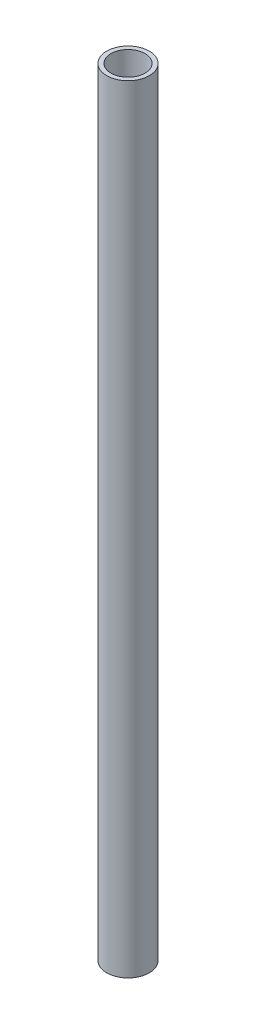
ISO-10303-21;
HEADER;
FILE_DESCRIPTION(('STEP AP214'),'2;1');
FILE_NAME('part.step','',(''),(''),'','','');
FILE_SCHEMA(('AUTOMOTIVE_DESIGN { 1 0 10303 214 1 1 1 1 }'));
ENDSEC;
DATA;
#1=APPLICATION_CONTEXT('core data for automotive mechanical design processes');
#2=APPLICATION_PROTOCOL_DEFINITION('international standard','automotive_design',2000,#1);
#3=PRODUCT_CONTEXT('',#1,'mechanical');
#4=PRODUCT('Part','Part','',(#3));
#5=PRODUCT_RELATED_PRODUCT_CATEGORY('part','',(#4));
#6=PRODUCT_DEFINITION_FORMATION('','',#4);
#7=PRODUCT_DEFINITION_CONTEXT('part definition',#1,'design');
#8=PRODUCT_DEFINITION('design','',#6,#7);
#9=PRODUCT_DEFINITION_SHAPE('','',#8);
#10=(LENGTH_UNIT() NAMED_UNIT(*) SI_UNIT(.MILLI.,.METRE.));
#11=(NAMED_UNIT(*) PLANE_ANGLE_UNIT() SI_UNIT($,.RADIAN.));
#12=(NAMED_UNIT(*) SI_UNIT($,.STERADIAN.) SOLID_ANGLE_UNIT());
#13=UNCERTAINTY_MEASURE_WITH_UNIT(LENGTH_MEASURE(1.E-05),#10,'distance_accuracy_value','');
#14=(GEOMETRIC_REPRESENTATION_CONTEXT(3) GLOBAL_UNCERTAINTY_ASSIGNED_CONTEXT((#13)) GLOBAL_UNIT_ASSIGNED_CONTEXT((#10,
#11,#12)) REPRESENTATION_CONTEXT('',''));
#15=CARTESIAN_POINT('',(0.,0.,0.));
#16=DIRECTION('',(0.,0.,1.));
#17=DIRECTION('',(1.,0.,0.));
#18=AXIS2_PLACEMENT_3D('',#15,#16,#17);
#19=CARTESIAN_POINT('',(0.,609.6,0.));
#20=DIRECTION('',(0.,1.,0.));
#21=DIRECTION('',(0.,0.,1.));
#22=AXIS2_PLACEMENT_3D('',#19,#20,#21);
#23=PLANE('',#22);
#24=CARTESIAN_POINT('',(0.,609.6,0.));
#25=DIRECTION('',(0.,1.,0.));
#26=DIRECTION('',(0.,0.,1.));
#27=AXIS2_PLACEMENT_3D('',#24,#25,#26);
#28=CIRCLE('',#27,16.7005);
#29=CARTESIAN_POINT('',(0.,609.6,-16.7005));
#30=VERTEX_POINT('',#29);
#31=EDGE_CURVE('E10',#30,#30,#28,.T.);
#32=ORIENTED_EDGE('',*,*,#31,.T.);
#33=EDGE_LOOP('',(#32));
#34=FACE_BOUND('',#33,.T.);
#35=CARTESIAN_POINT('',(0.,609.6,0.));
#36=DIRECTION('',(0.,1.,0.));
#37=DIRECTION('',(0.,0.,1.));
#38=AXIS2_PLACEMENT_3D('',#35,#36,#37);
#39=CIRCLE('',#38,13.335);
#40=CARTESIAN_POINT('',(0.,609.6,-13.335));
#41=VERTEX_POINT('',#40);
#42=EDGE_CURVE('E46',#41,#41,#39,.T.);
#43=ORIENTED_EDGE('',*,*,#42,.F.);
#44=EDGE_LOOP('',(#43));
#45=FACE_BOUND('',#44,.T.);
#46=ADVANCED_FACE('F32',(#34,#45),#23,.T.);
#47=CARTESIAN_POINT('',(0.,0.,0.));
#48=DIRECTION('',(0.,1.,0.));
#49=DIRECTION('',(0.,0.,1.));
#50=AXIS2_PLACEMENT_3D('',#47,#48,#49);
#51=PLANE('',#50);
#52=CARTESIAN_POINT('',(0.,0.,0.));
#53=DIRECTION('',(0.,1.,0.));
#54=DIRECTION('',(0.,0.,1.));
#55=AXIS2_PLACEMENT_3D('',#52,#53,#54);
#56=CIRCLE('',#55,16.7005);
#57=CARTESIAN_POINT('',(0.,0.,-16.7005));
#58=VERTEX_POINT('',#57);
#59=EDGE_CURVE('E36',#58,#58,#56,.T.);
#60=ORIENTED_EDGE('',*,*,#59,.F.);
#61=EDGE_LOOP('',(#60));
#62=FACE_BOUND('',#61,.T.);
#63=CARTESIAN_POINT('',(0.,0.,0.));
#64=DIRECTION('',(0.,1.,0.));
#65=DIRECTION('',(0.,0.,1.));
#66=AXIS2_PLACEMENT_3D('',#63,#64,#65);
#67=CIRCLE('',#66,13.335);
#68=CARTESIAN_POINT('',(0.,0.,-13.335));
#69=VERTEX_POINT('',#68);
#70=EDGE_CURVE('E48',#69,#69,#67,.T.);
#71=ORIENTED_EDGE('',*,*,#70,.T.);
#72=EDGE_LOOP('',(#71));
#73=FACE_BOUND('',#72,.T.);
#74=ADVANCED_FACE('F61',(#62,#73),#51,.F.);
#75=CARTESIAN_POINT('',(0.,609.6,0.));
#76=DIRECTION('',(0.,-1.,0.));
#77=DIRECTION('',(0.,0.,-1.));
#78=AXIS2_PLACEMENT_3D('',#75,#76,#77);
#79=CYLINDRICAL_SURFACE('',#78,16.7005);
#80=CARTESIAN_POINT('',(0.,609.6,-16.7005));
#81=CARTESIAN_POINT('',(0.,603.25,-16.7005));
#82=CARTESIAN_POINT('',(0.,596.9,-16.7005));
#83=CARTESIAN_POINT('',(0.,584.2,-16.7005));
#84=CARTESIAN_POINT('',(0.,577.85,-16.7005));
#85=CARTESIAN_POINT('',(0.,565.15,-16.7005));
#86=CARTESIAN_POINT('',(0.,558.8,-16.7005));
#87=CARTESIAN_POINT('',(0.,546.1,-16.7005));
#88=CARTESIAN_POINT('',(0.,539.75,-16.7005));
#89=CARTESIAN_POINT('',(0.,527.05,-16.7005));
#90=CARTESIAN_POINT('',(0.,520.7,-16.7005));
#91=CARTESIAN_POINT('',(0.,508.,-16.7005));
#92=CARTESIAN_POINT('',(0.,501.65,-16.7005));
#93=CARTESIAN_POINT('',(0.,488.95,-16.7005));
#94=CARTESIAN_POINT('',(0.,482.6,-16.7005));
#95=CARTESIAN_POINT('',(0.,469.9,-16.7005));
#96=CARTESIAN_POINT('',(0.,463.55,-16.7005));
#97=CARTESIAN_POINT('',(0.,450.85,-16.7005));
#98=CARTESIAN_POINT('',(0.,444.5,-16.7005));
#99=CARTESIAN_POINT('',(0.,431.8,-16.7005));
#100=CARTESIAN_POINT('',(0.,425.45,-16.7005));
#101=CARTESIAN_POINT('',(0.,412.75,-16.7005));
#102=CARTESIAN_POINT('',(0.,406.4,-16.7005));
#103=CARTESIAN_POINT('',(0.,393.7,-16.7005));
#104=CARTESIAN_POINT('',(0.,387.35,-16.7005));
#105=CARTESIAN_POINT('',(0.,374.65,-16.7005));
#106=CARTESIAN_POINT('',(0.,368.3,-16.7005));
#107=CARTESIAN_POINT('',(0.,355.6,-16.7005));
#108=CARTESIAN_POINT('',(0.,349.25,-16.7005));
#109=CARTESIAN_POINT('',(0.,336.55,-16.7005));
#110=CARTESIAN_POINT('',(0.,330.2,-16.7005));
#111=CARTESIAN_POINT('',(0.,317.5,-16.7005));
#112=CARTESIAN_POINT('',(0.,311.15,-16.7005));
#113=CARTESIAN_POINT('',(0.,298.45,-16.7005));
#114=CARTESIAN_POINT('',(0.,292.1,-16.7005));
#115=CARTESIAN_POINT('',(0.,279.4,-16.7005));
#116=CARTESIAN_POINT('',(0.,273.05,-16.7005));
#117=CARTESIAN_POINT('',(0.,260.35,-16.7005));
#118=CARTESIAN_POINT('',(0.,254.,-16.7005));
#119=CARTESIAN_POINT('',(0.,241.3,-16.7005));
#120=CARTESIAN_POINT('',(0.,234.95,-16.7005));
#121=CARTESIAN_POINT('',(0.,222.25,-16.7005));
#122=CARTESIAN_POINT('',(0.,215.9,-16.7005));
#123=CARTESIAN_POINT('',(0.,203.2,-16.7005));
#124=CARTESIAN_POINT('',(0.,196.85,-16.7005));
#125=CARTESIAN_POINT('',(0.,184.15,-16.7005));
#126=CARTESIAN_POINT('',(0.,177.8,-16.7005));
#127=CARTESIAN_POINT('',(0.,165.1,-16.7005));
#128=CARTESIAN_POINT('',(0.,158.75,-16.7005));
#129=CARTESIAN_POINT('',(0.,146.05,-16.7005));
#130=CARTESIAN_POINT('',(0.,139.7,-16.7005));
#131=CARTESIAN_POINT('',(0.,127.,-16.7005));
#132=CARTESIAN_POINT('',(0.,120.65,-16.7005));
#133=CARTESIAN_POINT('',(0.,107.95,-16.7005));
#134=CARTESIAN_POINT('',(0.,101.6,-16.7005));
#135=CARTESIAN_POINT('',(0.,88.9,-16.7005));
#136=CARTESIAN_POINT('',(0.,82.5500000000001,-16.7005));
#137=CARTESIAN_POINT('',(0.,69.85,-16.7005));
#138=CARTESIAN_POINT('',(0.,63.5,-16.7005));
#139=CARTESIAN_POINT('',(0.,50.8,-16.7005));
#140=CARTESIAN_POINT('',(0.,44.45,-16.7005));
#141=CARTESIAN_POINT('',(0.,31.75,-16.7005));
#142=CARTESIAN_POINT('',(0.,25.4,-16.7005));
#143=CARTESIAN_POINT('',(0.,12.7,-16.7005));
#144=CARTESIAN_POINT('',(0.,6.35000000000001,-16.7005));
#145=CARTESIAN_POINT('',(0.,0.,-16.7005));
#146=B_SPLINE_CURVE_WITH_KNOTS('',3,(#80,#81,#82,#83,#84,#85,#86,#87,#88,#89,#90,#91,#92,#93,
#94,#95,#96,#97,#98,#99,#100,#101,#102,#103,#104,#105,#106,#107,#108,#109,#110,#111,#112,#113,
#114,#115,#116,#117,#118,#119,#120,#121,#122,#123,#124,#125,#126,#127,#128,#129,#130,#131,#132,
#133,#134,#135,#136,#137,#138,#139,#140,#141,#142,#143,#144,#145),.UNSPECIFIED.,.F.,.F.,(4,2,2,
2,2,2,2,2,2,2,2,2,2,2,2,2,2,2,2,2,2,2,2,2,2,2,2,2,2,2,2,2,4),(0.,19.05,38.1,57.15,76.2,
95.2500000000001,114.3,133.35,152.4,171.45,190.5,209.55,228.6,247.65,266.7,285.75,304.8,323.85,
342.9,361.95,381.,400.05,419.1,438.15,457.2,476.25,495.3,514.35,533.4,552.45,571.5,590.55,
609.6),.UNSPECIFIED.);
#147=EDGE_CURVE('BSEAM34',#30,#58,#146,.T.);
#148=ORIENTED_EDGE('',*,*,#31,.F.);
#149=ORIENTED_EDGE('',*,*,#59,.T.);
#150=ORIENTED_EDGE('',*,*,#147,.T.);
#151=ORIENTED_EDGE('',*,*,#147,.F.);
#152=EDGE_LOOP('',(#148,#150,#149,#151));
#153=FACE_BOUND('',#152,.T.);
#154=ADVANCED_FACE('F34',(#153),#79,.T.);
#155=CARTESIAN_POINT('',(0.,609.6,0.));
#156=DIRECTION('',(0.,-1.,0.));
#157=DIRECTION('',(0.,0.,-1.));
#158=AXIS2_PLACEMENT_3D('',#155,#156,#157);
#159=CYLINDRICAL_SURFACE('',#158,13.335);
#160=CARTESIAN_POINT('',(0.,609.6,-13.335));
#161=CARTESIAN_POINT('',(0.,603.25,-13.335));
#162=CARTESIAN_POINT('',(0.,596.9,-13.335));
#163=CARTESIAN_POINT('',(0.,584.2,-13.335));
#164=CARTESIAN_POINT('',(0.,577.85,-13.335));
#165=CARTESIAN_POINT('',(0.,565.15,-13.335));
#166=CARTESIAN_POINT('',(0.,558.8,-13.335));
#167=CARTESIAN_POINT('',(0.,546.1,-13.335));
#168=CARTESIAN_POINT('',(0.,539.75,-13.335));
#169=CARTESIAN_POINT('',(0.,527.05,-13.335));
#170=CARTESIAN_POINT('',(0.,520.7,-13.335));
#171=CARTESIAN_POINT('',(0.,508.,-13.335));
#172=CARTESIAN_POINT('',(0.,501.65,-13.335));
#173=CARTESIAN_POINT('',(0.,488.95,-13.335));
#174=CARTESIAN_POINT('',(0.,482.6,-13.335));
#175=CARTESIAN_POINT('',(0.,469.9,-13.335));
#176=CARTESIAN_POINT('',(0.,463.55,-13.335));
#177=CARTESIAN_POINT('',(0.,450.85,-13.335));
#178=CARTESIAN_POINT('',(0.,444.5,-13.335));
#179=CARTESIAN_POINT('',(0.,431.8,-13.335));
#180=CARTESIAN_POINT('',(0.,425.45,-13.335));
#181=CARTESIAN_POINT('',(0.,412.75,-13.335));
#182=CARTESIAN_POINT('',(0.,406.4,-13.335));
#183=CARTESIAN_POINT('',(0.,393.7,-13.335));
#184=CARTESIAN_POINT('',(0.,387.35,-13.335));
#185=CARTESIAN_POINT('',(0.,374.65,-13.335));
#186=CARTESIAN_POINT('',(0.,368.3,-13.335));
#187=CARTESIAN_POINT('',(0.,355.6,-13.335));
#188=CARTESIAN_POINT('',(0.,349.25,-13.335));
#189=CARTESIAN_POINT('',(0.,336.55,-13.335));
#190=CARTESIAN_POINT('',(0.,330.2,-13.335));
#191=CARTESIAN_POINT('',(0.,317.5,-13.335));
#192=CARTESIAN_POINT('',(0.,311.15,-13.335));
#193=CARTESIAN_POINT('',(0.,298.45,-13.335));
#194=CARTESIAN_POINT('',(0.,292.1,-13.335));
#195=CARTESIAN_POINT('',(0.,279.4,-13.335));
#196=CARTESIAN_POINT('',(0.,273.05,-13.335));
#197=CARTESIAN_POINT('',(0.,260.35,-13.335));
#198=CARTESIAN_POINT('',(0.,254.,-13.335));
#199=CARTESIAN_POINT('',(0.,241.3,-13.335));
#200=CARTESIAN_POINT('',(0.,234.95,-13.335));
#201=CARTESIAN_POINT('',(0.,222.25,-13.335));
#202=CARTESIAN_POINT('',(0.,215.9,-13.335));
#203=CARTESIAN_POINT('',(0.,203.2,-13.335));
#204=CARTESIAN_POINT('',(0.,196.85,-13.335));
#205=CARTESIAN_POINT('',(0.,184.15,-13.335));
#206=CARTESIAN_POINT('',(0.,177.8,-13.335));
#207=CARTESIAN_POINT('',(0.,165.1,-13.335));
#208=CARTESIAN_POINT('',(0.,158.75,-13.335));
#209=CARTESIAN_POINT('',(0.,146.05,-13.335));
#210=CARTESIAN_POINT('',(0.,139.7,-13.335));
#211=CARTESIAN_POINT('',(0.,127.,-13.335));
#212=CARTESIAN_POINT('',(0.,120.65,-13.335));
#213=CARTESIAN_POINT('',(0.,107.95,-13.335));
#214=CARTESIAN_POINT('',(0.,101.6,-13.335));
#215=CARTESIAN_POINT('',(0.,88.9,-13.335));
#216=CARTESIAN_POINT('',(0.,82.5500000000001,-13.335));
#217=CARTESIAN_POINT('',(0.,69.85,-13.335));
#218=CARTESIAN_POINT('',(0.,63.5,-13.335));
#219=CARTESIAN_POINT('',(0.,50.8,-13.335));
#220=CARTESIAN_POINT('',(0.,44.45,-13.335));
#221=CARTESIAN_POINT('',(0.,31.75,-13.335));
#222=CARTESIAN_POINT('',(0.,25.4,-13.335));
#223=CARTESIAN_POINT('',(0.,12.7,-13.335));
#224=CARTESIAN_POINT('',(0.,6.35000000000001,-13.335));
#225=CARTESIAN_POINT('',(0.,0.,-13.335));
#226=B_SPLINE_CURVE_WITH_KNOTS('',3,(#160,#161,#162,#163,#164,#165,#166,#167,#168,#169,#170,
#171,#172,#173,#174,#175,#176,#177,#178,#179,#180,#181,#182,#183,#184,#185,#186,#187,#188,#189,
#190,#191,#192,#193,#194,#195,#196,#197,#198,#199,#200,#201,#202,#203,#204,#205,#206,#207,#208,
#209,#210,#211,#212,#213,#214,#215,#216,#217,#218,#219,#220,#221,#222,#223,#224,#225),
.UNSPECIFIED.,.F.,.F.,(4,2,2,2,2,2,2,2,2,2,2,2,2,2,2,2,2,2,2,2,2,2,2,2,2,2,2,2,2,2,2,2,4),(0.,
19.05,38.1,57.15,76.2,95.2500000000001,114.3,133.35,152.4,171.45,190.5,209.55,228.6,247.65,
266.7,285.75,304.8,323.85,342.9,361.95,381.,400.05,419.1,438.15,457.2,476.25,495.3,514.35,533.4,
552.45,571.5,590.55,609.6),.UNSPECIFIED.);
#227=EDGE_CURVE('BSEAM57',#41,#69,#226,.T.);
#228=ORIENTED_EDGE('',*,*,#42,.T.);
#229=ORIENTED_EDGE('',*,*,#70,.F.);
#230=ORIENTED_EDGE('',*,*,#227,.T.);
#231=ORIENTED_EDGE('',*,*,#227,.F.);
#232=EDGE_LOOP('',(#228,#230,#229,#231));
#233=FACE_BOUND('',#232,.T.);
#234=ADVANCED_FACE('F57',(#233),#159,.F.);
#235=CLOSED_SHELL('',(#46,#74,#154,#234));
#236=MANIFOLD_SOLID_BREP('B2',#235);
#237=ADVANCED_BREP_SHAPE_REPRESENTATION('',(#18,#236),#14);
#238=SHAPE_DEFINITION_REPRESENTATION(#9,#237);
ENDSEC;
END-ISO-10303-21;
